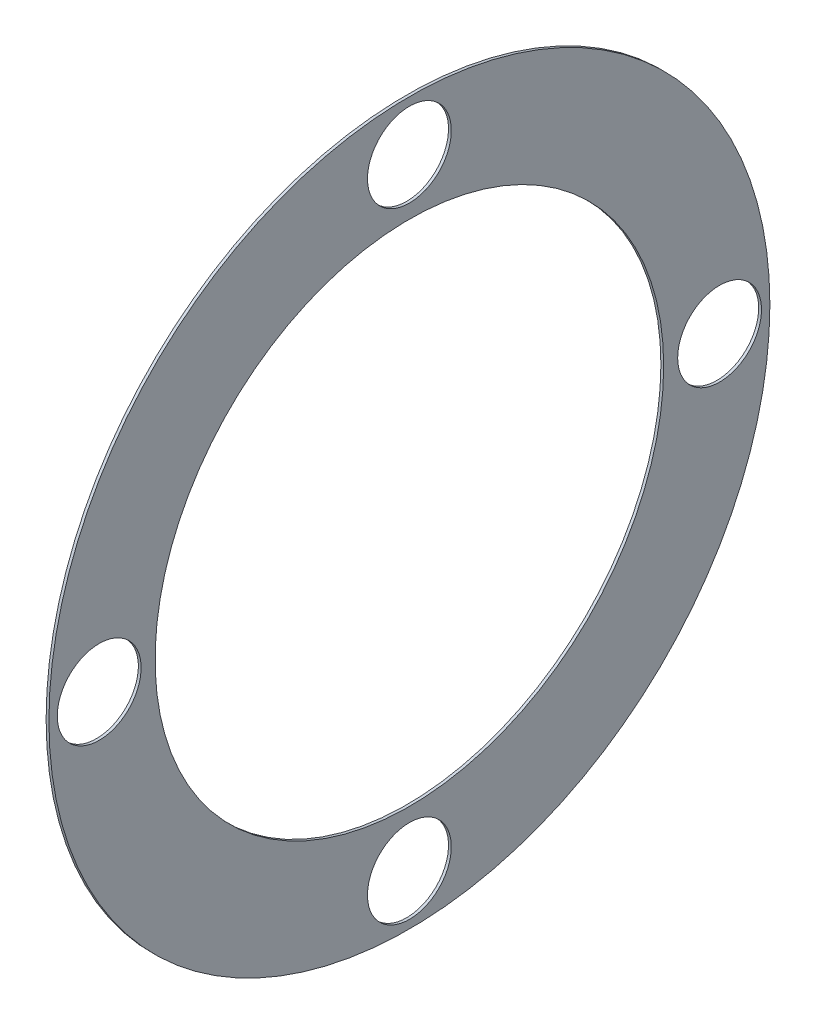
ISO-10303-21;
HEADER;
FILE_DESCRIPTION(('STEP AP214'),'2;1');
FILE_NAME('part.step','',(''),(''),'','','');
FILE_SCHEMA(('AUTOMOTIVE_DESIGN { 1 0 10303 214 1 1 1 1 }'));
ENDSEC;
DATA;
#1=APPLICATION_CONTEXT('core data for automotive mechanical design processes');
#2=APPLICATION_PROTOCOL_DEFINITION('international standard','automotive_design',2000,#1);
#3=PRODUCT_CONTEXT('',#1,'mechanical');
#4=PRODUCT('Part','Part','',(#3));
#5=PRODUCT_RELATED_PRODUCT_CATEGORY('part','',(#4));
#6=PRODUCT_DEFINITION_FORMATION('','',#4);
#7=PRODUCT_DEFINITION_CONTEXT('part definition',#1,'design');
#8=PRODUCT_DEFINITION('design','',#6,#7);
#9=PRODUCT_DEFINITION_SHAPE('','',#8);
#10=(LENGTH_UNIT() NAMED_UNIT(*) SI_UNIT(.MILLI.,.METRE.));
#11=(NAMED_UNIT(*) PLANE_ANGLE_UNIT() SI_UNIT($,.RADIAN.));
#12=(NAMED_UNIT(*) SI_UNIT($,.STERADIAN.) SOLID_ANGLE_UNIT());
#13=UNCERTAINTY_MEASURE_WITH_UNIT(LENGTH_MEASURE(1.E-05),#10,'distance_accuracy_value','');
#14=(GEOMETRIC_REPRESENTATION_CONTEXT(3) GLOBAL_UNCERTAINTY_ASSIGNED_CONTEXT((#13)) GLOBAL_UNIT_ASSIGNED_CONTEXT((#10,
#11,#12)) REPRESENTATION_CONTEXT('',''));
#15=CARTESIAN_POINT('',(0.,0.,0.));
#16=DIRECTION('',(0.,0.,1.));
#17=DIRECTION('',(1.,0.,0.));
#18=AXIS2_PLACEMENT_3D('',#15,#16,#17);
#19=CARTESIAN_POINT('',(-0.15,0.,0.));
#20=DIRECTION('',(1.,0.,0.));
#21=DIRECTION('',(0.,0.,-1.));
#22=AXIS2_PLACEMENT_3D('',#19,#20,#21);
#23=PLANE('',#22);
#24=CARTESIAN_POINT('',(-0.15,0.,0.));
#25=DIRECTION('',(1.,0.,0.));
#26=DIRECTION('',(0.,0.,-1.));
#27=AXIS2_PLACEMENT_3D('',#24,#25,#26);
#28=CIRCLE('',#27,19.35);
#29=CARTESIAN_POINT('',(-0.15,0.,-19.35));
#30=VERTEX_POINT('',#29);
#31=EDGE_CURVE('E41',#30,#30,#28,.T.);
#32=ORIENTED_EDGE('',*,*,#31,.F.);
#33=EDGE_LOOP('',(#32));
#34=FACE_BOUND('',#33,.T.);
#35=CARTESIAN_POINT('',(-0.15,0.,-16.65));
#36=DIRECTION('',(-1.,0.,0.));
#37=DIRECTION('',(0.,0.,1.));
#38=AXIS2_PLACEMENT_3D('',#35,#36,#37);
#39=CIRCLE('',#38,2.25);
#40=CARTESIAN_POINT('',(-0.15,0.,-14.4));
#41=VERTEX_POINT('',#40);
#42=EDGE_CURVE('E44',#41,#41,#39,.F.);
#43=ORIENTED_EDGE('',*,*,#42,.T.);
#44=EDGE_LOOP('',(#43));
#45=FACE_BOUND('',#44,.T.);
#46=CARTESIAN_POINT('',(-0.15,-16.65,0.));
#47=DIRECTION('',(-1.,0.,0.));
#48=DIRECTION('',(0.,0.,1.));
#49=AXIS2_PLACEMENT_3D('',#46,#47,#48);
#50=CIRCLE('',#49,2.25);
#51=CARTESIAN_POINT('',(-0.15,-16.65,2.25));
#52=VERTEX_POINT('',#51);
#53=EDGE_CURVE('E47',#52,#52,#50,.F.);
#54=ORIENTED_EDGE('',*,*,#53,.T.);
#55=EDGE_LOOP('',(#54));
#56=FACE_BOUND('',#55,.T.);
#57=CARTESIAN_POINT('',(-0.15,0.,16.65));
#58=DIRECTION('',(-1.,0.,0.));
#59=DIRECTION('',(0.,0.,1.));
#60=AXIS2_PLACEMENT_3D('',#57,#58,#59);
#61=CIRCLE('',#60,2.25);
#62=CARTESIAN_POINT('',(-0.15,0.,18.9));
#63=VERTEX_POINT('',#62);
#64=EDGE_CURVE('E50',#63,#63,#61,.F.);
#65=ORIENTED_EDGE('',*,*,#64,.T.);
#66=EDGE_LOOP('',(#65));
#67=FACE_BOUND('',#66,.T.);
#68=CARTESIAN_POINT('',(-0.15,0.,0.));
#69=DIRECTION('',(1.,0.,0.));
#70=DIRECTION('',(0.,0.,-1.));
#71=AXIS2_PLACEMENT_3D('',#68,#69,#70);
#72=CIRCLE('',#71,13.65);
#73=CARTESIAN_POINT('',(-0.15,0.,-13.65));
#74=VERTEX_POINT('',#73);
#75=EDGE_CURVE('E52',#74,#74,#72,.T.);
#76=ORIENTED_EDGE('',*,*,#75,.T.);
#77=EDGE_LOOP('',(#76));
#78=FACE_BOUND('',#77,.T.);
#79=CARTESIAN_POINT('',(-0.15,16.65,0.));
#80=DIRECTION('',(-1.,0.,0.));
#81=DIRECTION('',(0.,0.,1.));
#82=AXIS2_PLACEMENT_3D('',#79,#80,#81);
#83=CIRCLE('',#82,2.25);
#84=CARTESIAN_POINT('',(-0.15,16.65,2.25));
#85=VERTEX_POINT('',#84);
#86=EDGE_CURVE('E18',#85,#85,#83,.F.);
#87=ORIENTED_EDGE('',*,*,#86,.T.);
#88=EDGE_LOOP('',(#87));
#89=FACE_BOUND('',#88,.T.);
#90=ADVANCED_FACE('F15',(#34,#45,#56,#67,#78,#89),#23,.F.);
#91=CARTESIAN_POINT('',(0.,16.65,0.));
#92=DIRECTION('',(-1.,0.,0.));
#93=DIRECTION('',(0.,0.,1.));
#94=AXIS2_PLACEMENT_3D('',#91,#92,#93);
#95=CYLINDRICAL_SURFACE('',#94,2.25);
#96=ORIENTED_EDGE('',*,*,#86,.F.);
#97=EDGE_LOOP('',(#96));
#98=FACE_BOUND('',#97,.T.);
#99=CARTESIAN_POINT('',(0.,16.65,0.));
#100=DIRECTION('',(-1.,0.,0.));
#101=DIRECTION('',(0.,0.,1.));
#102=AXIS2_PLACEMENT_3D('',#99,#100,#101);
#103=CIRCLE('',#102,2.25);
#104=CARTESIAN_POINT('',(0.,16.65,2.25));
#105=VERTEX_POINT('',#104);
#106=EDGE_CURVE('E38',#105,#105,#103,.T.);
#107=ORIENTED_EDGE('',*,*,#106,.F.);
#108=EDGE_LOOP('',(#107));
#109=FACE_BOUND('',#108,.T.);
#110=ADVANCED_FACE('F60',(#98,#109),#95,.F.);
#111=CARTESIAN_POINT('',(-0.1575,0.,0.));
#112=DIRECTION('',(1.,0.,0.));
#113=DIRECTION('',(0.,0.,-1.));
#114=AXIS2_PLACEMENT_3D('',#111,#112,#113);
#115=CYLINDRICAL_SURFACE('',#114,13.65);
#116=ORIENTED_EDGE('',*,*,#75,.F.);
#117=EDGE_LOOP('',(#116));
#118=FACE_BOUND('',#117,.T.);
#119=CARTESIAN_POINT('',(0.,0.,0.));
#120=DIRECTION('',(1.,0.,0.));
#121=DIRECTION('',(0.,0.,-1.));
#122=AXIS2_PLACEMENT_3D('',#119,#120,#121);
#123=CIRCLE('',#122,13.65);
#124=CARTESIAN_POINT('',(0.,0.,-13.65));
#125=VERTEX_POINT('',#124);
#126=EDGE_CURVE('E35',#125,#125,#123,.F.);
#127=ORIENTED_EDGE('',*,*,#126,.F.);
#128=EDGE_LOOP('',(#127));
#129=FACE_BOUND('',#128,.T.);
#130=ADVANCED_FACE('F63',(#118,#129),#115,.F.);
#131=CARTESIAN_POINT('',(0.,0.,16.65));
#132=DIRECTION('',(-1.,0.,0.));
#133=DIRECTION('',(0.,0.,1.));
#134=AXIS2_PLACEMENT_3D('',#131,#132,#133);
#135=CYLINDRICAL_SURFACE('',#134,2.25);
#136=ORIENTED_EDGE('',*,*,#64,.F.);
#137=EDGE_LOOP('',(#136));
#138=FACE_BOUND('',#137,.T.);
#139=CARTESIAN_POINT('',(0.,0.,16.65));
#140=DIRECTION('',(-1.,0.,0.));
#141=DIRECTION('',(0.,0.,1.));
#142=AXIS2_PLACEMENT_3D('',#139,#140,#141);
#143=CIRCLE('',#142,2.25);
#144=CARTESIAN_POINT('',(0.,0.,18.9));
#145=VERTEX_POINT('',#144);
#146=EDGE_CURVE('E32',#145,#145,#143,.T.);
#147=ORIENTED_EDGE('',*,*,#146,.F.);
#148=EDGE_LOOP('',(#147));
#149=FACE_BOUND('',#148,.T.);
#150=ADVANCED_FACE('F85',(#138,#149),#135,.F.);
#151=CARTESIAN_POINT('',(0.,-16.65,0.));
#152=DIRECTION('',(-1.,0.,0.));
#153=DIRECTION('',(0.,0.,1.));
#154=AXIS2_PLACEMENT_3D('',#151,#152,#153);
#155=CYLINDRICAL_SURFACE('',#154,2.25);
#156=ORIENTED_EDGE('',*,*,#53,.F.);
#157=EDGE_LOOP('',(#156));
#158=FACE_BOUND('',#157,.T.);
#159=CARTESIAN_POINT('',(0.,-16.65,0.));
#160=DIRECTION('',(-1.,0.,0.));
#161=DIRECTION('',(0.,0.,1.));
#162=AXIS2_PLACEMENT_3D('',#159,#160,#161);
#163=CIRCLE('',#162,2.25);
#164=CARTESIAN_POINT('',(0.,-16.65,2.25));
#165=VERTEX_POINT('',#164);
#166=EDGE_CURVE('E27',#165,#165,#163,.T.);
#167=ORIENTED_EDGE('',*,*,#166,.F.);
#168=EDGE_LOOP('',(#167));
#169=FACE_BOUND('',#168,.T.);
#170=ADVANCED_FACE('F81',(#158,#169),#155,.F.);
#171=CARTESIAN_POINT('',(0.,0.,-16.65));
#172=DIRECTION('',(-1.,0.,0.));
#173=DIRECTION('',(0.,0.,1.));
#174=AXIS2_PLACEMENT_3D('',#171,#172,#173);
#175=CYLINDRICAL_SURFACE('',#174,2.25);
#176=ORIENTED_EDGE('',*,*,#42,.F.);
#177=EDGE_LOOP('',(#176));
#178=FACE_BOUND('',#177,.T.);
#179=CARTESIAN_POINT('',(0.,0.,-16.65));
#180=DIRECTION('',(-1.,0.,0.));
#181=DIRECTION('',(0.,0.,1.));
#182=AXIS2_PLACEMENT_3D('',#179,#180,#181);
#183=CIRCLE('',#182,2.25);
#184=CARTESIAN_POINT('',(0.,0.,-14.4));
#185=VERTEX_POINT('',#184);
#186=EDGE_CURVE('E22',#185,#185,#183,.T.);
#187=ORIENTED_EDGE('',*,*,#186,.F.);
#188=EDGE_LOOP('',(#187));
#189=FACE_BOUND('',#188,.T.);
#190=ADVANCED_FACE('F74',(#178,#189),#175,.F.);
#191=CARTESIAN_POINT('',(-0.1575,0.,0.));
#192=DIRECTION('',(1.,0.,0.));
#193=DIRECTION('',(0.,0.,-1.));
#194=AXIS2_PLACEMENT_3D('',#191,#192,#193);
#195=CYLINDRICAL_SURFACE('',#194,19.35);
#196=CARTESIAN_POINT('',(0.,0.,0.));
#197=DIRECTION('',(1.,0.,0.));
#198=DIRECTION('',(0.,0.,-1.));
#199=AXIS2_PLACEMENT_3D('',#196,#197,#198);
#200=CIRCLE('',#199,19.35);
#201=CARTESIAN_POINT('',(0.,0.,-19.35));
#202=VERTEX_POINT('',#201);
#203=EDGE_CURVE('E10',#202,#202,#200,.T.);
#204=ORIENTED_EDGE('',*,*,#203,.F.);
#205=EDGE_LOOP('',(#204));
#206=FACE_BOUND('',#205,.T.);
#207=ORIENTED_EDGE('',*,*,#31,.T.);
#208=EDGE_LOOP('',(#207));
#209=FACE_BOUND('',#208,.T.);
#210=ADVANCED_FACE('F68',(#206,#209),#195,.T.);
#211=CARTESIAN_POINT('',(0.,0.,0.));
#212=DIRECTION('',(1.,0.,0.));
#213=DIRECTION('',(0.,0.,-1.));
#214=AXIS2_PLACEMENT_3D('',#211,#212,#213);
#215=PLANE('',#214);
#216=ORIENTED_EDGE('',*,*,#203,.T.);
#217=EDGE_LOOP('',(#216));
#218=FACE_BOUND('',#217,.T.);
#219=ORIENTED_EDGE('',*,*,#186,.T.);
#220=EDGE_LOOP('',(#219));
#221=FACE_BOUND('',#220,.T.);
#222=ORIENTED_EDGE('',*,*,#166,.T.);
#223=EDGE_LOOP('',(#222));
#224=FACE_BOUND('',#223,.T.);
#225=ORIENTED_EDGE('',*,*,#146,.T.);
#226=EDGE_LOOP('',(#225));
#227=FACE_BOUND('',#226,.T.);
#228=ORIENTED_EDGE('',*,*,#126,.T.);
#229=EDGE_LOOP('',(#228));
#230=FACE_BOUND('',#229,.T.);
#231=ORIENTED_EDGE('',*,*,#106,.T.);
#232=EDGE_LOOP('',(#231));
#233=FACE_BOUND('',#232,.T.);
#234=ADVANCED_FACE('F66',(#218,#221,#224,#227,#230,#233),#215,.T.);
#235=CLOSED_SHELL('',(#90,#110,#130,#150,#170,#190,#210,#234));
#236=MANIFOLD_SOLID_BREP('B1',#235);
#237=ADVANCED_BREP_SHAPE_REPRESENTATION('',(#18,#236),#14);
#238=SHAPE_DEFINITION_REPRESENTATION(#9,#237);
ENDSEC;
END-ISO-10303-21;
